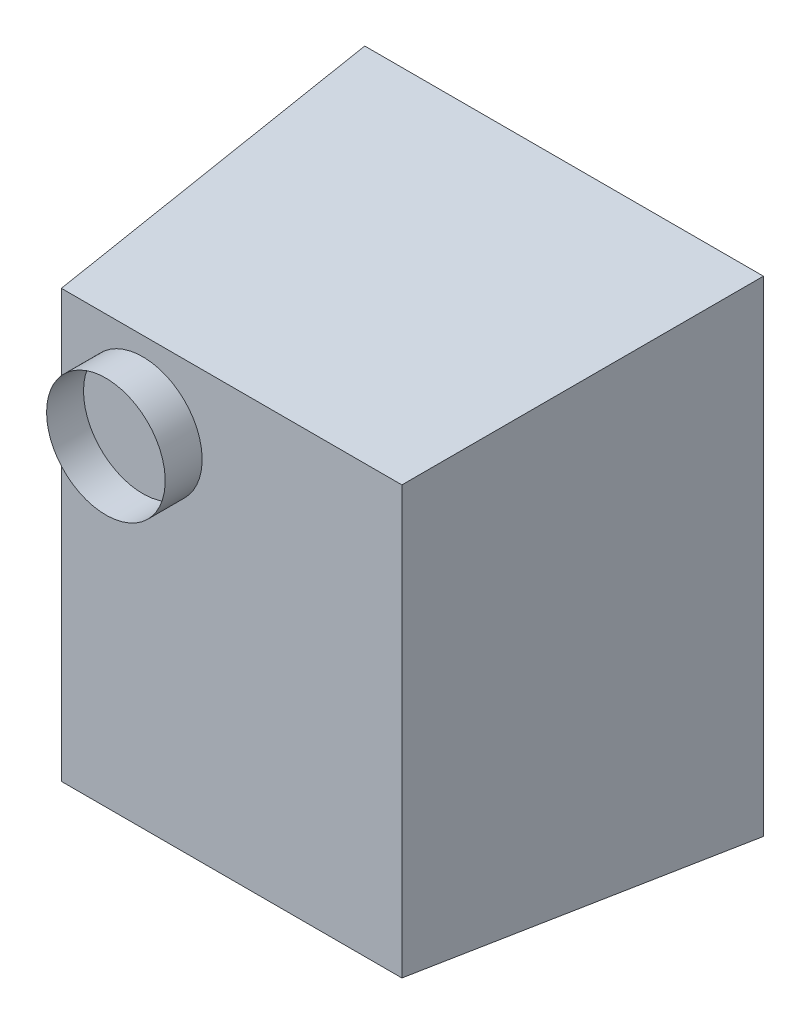
ISO-10303-21;
HEADER;
FILE_DESCRIPTION(('STEP AP214'),'2;1');
FILE_NAME('part.step','',(''),(''),'','','');
FILE_SCHEMA(('AUTOMOTIVE_DESIGN { 1 0 10303 214 1 1 1 1 }'));
ENDSEC;
DATA;
#1=APPLICATION_CONTEXT('core data for automotive mechanical design processes');
#2=APPLICATION_PROTOCOL_DEFINITION('international standard','automotive_design',2000,#1);
#3=PRODUCT_CONTEXT('',#1,'mechanical');
#4=PRODUCT('Part','Part','',(#3));
#5=PRODUCT_RELATED_PRODUCT_CATEGORY('part','',(#4));
#6=PRODUCT_DEFINITION_FORMATION('','',#4);
#7=PRODUCT_DEFINITION_CONTEXT('part definition',#1,'design');
#8=PRODUCT_DEFINITION('design','',#6,#7);
#9=PRODUCT_DEFINITION_SHAPE('','',#8);
#10=(LENGTH_UNIT() NAMED_UNIT(*) SI_UNIT(.MILLI.,.METRE.));
#11=(NAMED_UNIT(*) PLANE_ANGLE_UNIT() SI_UNIT($,.RADIAN.));
#12=(NAMED_UNIT(*) SI_UNIT($,.STERADIAN.) SOLID_ANGLE_UNIT());
#13=UNCERTAINTY_MEASURE_WITH_UNIT(LENGTH_MEASURE(1.E-05),#10,'distance_accuracy_value','');
#14=(GEOMETRIC_REPRESENTATION_CONTEXT(3) GLOBAL_UNCERTAINTY_ASSIGNED_CONTEXT((#13)) GLOBAL_UNIT_ASSIGNED_CONTEXT((#10,
#11,#12)) REPRESENTATION_CONTEXT('',''));
#15=CARTESIAN_POINT('',(0.,0.,0.));
#16=DIRECTION('',(0.,0.,1.));
#17=DIRECTION('',(1.,0.,0.));
#18=AXIS2_PLACEMENT_3D('',#15,#16,#17);
#19=CARTESIAN_POINT('',(-0.046093499,-0.057806686,0.24));
#20=DIRECTION('',(0.,0.,1.));
#21=DIRECTION('',(1.,0.,0.));
#22=AXIS2_PLACEMENT_3D('',#19,#20,#21);
#23=PLANE('',#22);
#24=DIRECTION('',(0.,1.,0.));
#25=VECTOR('',#24,1.);
#26=CARTESIAN_POINT('',(0.046093499,-0.066468834,0.24));
#27=LINE('',#26,#25);
#28=CARTESIAN_POINT('',(0.046093498999738,0.0578066861034849,0.24));
#29=VERTEX_POINT('',#28);
#30=CARTESIAN_POINT('',(0.046093499,-0.057806686034757,0.239999999997005));
#31=VERTEX_POINT('',#30);
#32=EDGE_CURVE('P0_E20',#29,#31,#27,.F.);
#33=ORIENTED_EDGE('',*,*,#32,.F.);
#34=DIRECTION('',(1.,0.,0.));
#35=VECTOR('',#34,1.);
#36=CARTESIAN_POINT('',(-0.054615089,0.0578066859999995,0.24));
#37=LINE('',#36,#35);
#38=CARTESIAN_POINT('',(-0.0460934991892228,0.0578066860689899,0.239999999994537));
#39=VERTEX_POINT('',#38);
#40=EDGE_CURVE('P0_E58',#39,#29,#37,.T.);
#41=ORIENTED_EDGE('',*,*,#40,.F.);
#42=DIRECTION('',(0.,1.,0.));
#43=VECTOR('',#42,1.);
#44=CARTESIAN_POINT('',(-0.0460934990019112,-0.066468834,0.23999999997815));
#45=LINE('',#44,#43);
#46=CARTESIAN_POINT('',(-0.0460934991894848,-0.057806686000262,0.239999999991542));
#47=VERTEX_POINT('',#46);
#48=EDGE_CURVE('P0_E53',#47,#39,#45,.T.);
#49=ORIENTED_EDGE('',*,*,#48,.F.);
#50=DIRECTION('',(1.,0.,0.));
#51=VECTOR('',#50,1.);
#52=CARTESIAN_POINT('',(-0.054615089,-0.0578066860010481,0.23999999998802));
#53=LINE('',#52,#51);
#54=EDGE_CURVE('P0_E68',#31,#47,#53,.F.);
#55=ORIENTED_EDGE('',*,*,#54,.F.);
#56=EDGE_LOOP('',(#33,#41,#49,#55));
#57=FACE_BOUND('',#56,.T.);
#58=ADVANCED_FACE('P0_F17',(#57),#23,.T.);
#59=CARTESIAN_POINT('',(0.046093499,-0.066468834,0.24));
#60=DIRECTION('',(0.996194697820091,0.,0.0871557458526879));
#61=DIRECTION('',(0.0871557458526879,0.,-0.996194697820091));
#62=AXIS2_PLACEMENT_3D('',#59,#60,#61);
#63=PLANE('',#62);
#64=DIRECTION('',(0.,1.,0.));
#65=VECTOR('',#64,1.);
#66=CARTESIAN_POINT('',(0.053967479,-0.065680666,0.15));
#67=LINE('',#66,#65);
#68=CARTESIAN_POINT('',(0.0539674790000237,-0.0656806659938301,0.15));
#69=VERTEX_POINT('',#68);
#70=CARTESIAN_POINT('',(0.0539674790000003,0.0656806659907216,0.150000000000268));
#71=VERTEX_POINT('',#70);
#72=EDGE_CURVE('P0_E74',#69,#71,#67,.T.);
#73=ORIENTED_EDGE('',*,*,#72,.T.);
#74=DIRECTION('',(0.0868265969467221,0.0868265969341361,-0.992432508600705));
#75=VECTOR('',#74,1.);
#76=CARTESIAN_POINT('',(0.0460934990000001,0.0578066860010476,0.23999999998802));
#77=LINE('',#76,#75);
#78=EDGE_CURVE('P0_E63',#29,#71,#77,.T.);
#79=ORIENTED_EDGE('',*,*,#78,.F.);
#80=ORIENTED_EDGE('',*,*,#32,.T.);
#81=DIRECTION('',(-0.0868265969467221,0.0868265969341362,0.992432508600705));
#82=VECTOR('',#81,1.);
#83=CARTESIAN_POINT('',(0.0539674790000001,-0.0656806659999068,0.150000000001071));
#84=LINE('',#83,#82);
#85=EDGE_CURVE('P0_E81',#69,#31,#84,.T.);
#86=ORIENTED_EDGE('',*,*,#85,.F.);
#87=EDGE_LOOP('',(#73,#79,#80,#86));
#88=FACE_BOUND('',#87,.T.);
#89=ADVANCED_FACE('P0_F73',(#88),#63,.T.);
#90=CARTESIAN_POINT('',(-0.054615089,0.065680666,0.15));
#91=DIRECTION('',(0.,0.996194697820091,0.0871557458526879));
#92=DIRECTION('',(0.,-0.0871557458526879,0.996194697820091));
#93=AXIS2_PLACEMENT_3D('',#90,#91,#92);
#94=PLANE('',#93);
#95=DIRECTION('',(1.,0.,0.));
#96=VECTOR('',#95,1.);
#97=CARTESIAN_POINT('',(-0.053967479,0.06568066598766,0.15));
#98=LINE('',#97,#96);
#99=CARTESIAN_POINT('',(-0.0539674790835042,0.0656806659968681,0.149999999998124));
#100=VERTEX_POINT('',#99);
#101=EDGE_CURVE('P0_E84',#71,#100,#98,.F.);
#102=ORIENTED_EDGE('',*,*,#101,.T.);
#103=DIRECTION('',(-0.0868265969341423,0.0868265969459091,-0.992432508600776));
#104=VECTOR('',#103,1.);
#105=CARTESIAN_POINT('',(-0.0460934990019112,0.0578066860000001,0.23999999997815));
#106=LINE('',#105,#104);
#107=EDGE_CURVE('P0_E65',#39,#100,#106,.T.);
#108=ORIENTED_EDGE('',*,*,#107,.F.);
#109=ORIENTED_EDGE('',*,*,#40,.T.);
#110=ORIENTED_EDGE('',*,*,#78,.T.);
#111=EDGE_LOOP('',(#102,#108,#109,#110));
#112=FACE_BOUND('',#111,.T.);
#113=ADVANCED_FACE('P0_F61',(#112),#94,.T.);
#114=CARTESIAN_POINT('',(-0.053967479,-0.066468834,0.15));
#115=DIRECTION('',(-0.996194697820091,0.,0.0871557458526879));
#116=DIRECTION('',(0.0871557458526879,0.,0.996194697820091));
#117=AXIS2_PLACEMENT_3D('',#114,#115,#116);
#118=PLANE('',#117);
#119=DIRECTION('',(0.,1.,0.));
#120=VECTOR('',#119,1.);
#121=CARTESIAN_POINT('',(-0.05396747911112,-0.065680666,0.15));
#122=LINE('',#121,#120);
#123=CARTESIAN_POINT('',(-0.053967479055982,-0.0656806660000001,0.149999999995176));
#124=VERTEX_POINT('',#123);
#125=EDGE_CURVE('P0_E26',#100,#124,#122,.F.);
#126=ORIENTED_EDGE('',*,*,#125,.T.);
#127=DIRECTION('',(-0.0868265953961706,-0.0868265969459143,-0.99243250873533));
#128=VECTOR('',#127,1.);
#129=CARTESIAN_POINT('',(-0.04609349925166,-0.057806686,0.24));
#130=LINE('',#129,#128);
#131=EDGE_CURVE('P0_E34',#47,#124,#130,.T.);
#132=ORIENTED_EDGE('',*,*,#131,.F.);
#133=ORIENTED_EDGE('',*,*,#48,.T.);
#134=ORIENTED_EDGE('',*,*,#107,.T.);
#135=EDGE_LOOP('',(#126,#132,#133,#134));
#136=FACE_BOUND('',#135,.T.);
#137=ADVANCED_FACE('P0_F88',(#136),#118,.T.);
#138=CARTESIAN_POINT('',(-0.054615089,-0.057806686,0.24));
#139=DIRECTION('',(0.,-0.996194697820091,0.0871557458526879));
#140=DIRECTION('',(0.,-0.0871557458526879,-0.996194697820091));
#141=AXIS2_PLACEMENT_3D('',#138,#139,#140);
#142=PLANE('',#141);
#143=DIRECTION('',(1.,0.,0.));
#144=VECTOR('',#143,1.);
#145=CARTESIAN_POINT('',(-0.053967479,-0.065680666,0.15));
#146=LINE('',#145,#144);
#147=EDGE_CURVE('P0_E11',#124,#69,#146,.T.);
#148=ORIENTED_EDGE('',*,*,#147,.T.);
#149=ORIENTED_EDGE('',*,*,#85,.T.);
#150=ORIENTED_EDGE('',*,*,#54,.T.);
#151=ORIENTED_EDGE('',*,*,#131,.T.);
#152=EDGE_LOOP('',(#148,#149,#150,#151));
#153=FACE_BOUND('',#152,.T.);
#154=ADVANCED_FACE('P0_F91',(#153),#142,.T.);
#155=CARTESIAN_POINT('',(-0.053967479,-0.065680666,0.15));
#156=DIRECTION('',(0.,0.,1.));
#157=DIRECTION('',(1.,0.,0.));
#158=AXIS2_PLACEMENT_3D('',#155,#156,#157);
#159=PLANE('',#158);
#160=ORIENTED_EDGE('',*,*,#125,.F.);
#161=ORIENTED_EDGE('',*,*,#101,.F.);
#162=ORIENTED_EDGE('',*,*,#72,.F.);
#163=ORIENTED_EDGE('',*,*,#147,.F.);
#164=EDGE_LOOP('',(#160,#161,#162,#163));
#165=FACE_BOUND('',#164,.T.);
#166=ADVANCED_FACE('P0_F90',(#165),#159,.F.);
#167=CLOSED_SHELL('',(#58,#89,#113,#137,#154,#166));
#168=MANIFOLD_SOLID_BREP('P0_B1',#167);
#169=CARTESIAN_POINT('',(-0.024046523,0.036728116,0.25));
#170=DIRECTION('',(0.,0.,-1.));
#171=DIRECTION('',(-1.,0.,0.));
#172=AXIS2_PLACEMENT_3D('',#169,#170,#171);
#173=CYLINDRICAL_SURFACE('',#172,0.016056825);
#174=CARTESIAN_POINT('',(-0.024046523,0.036728116,0.24));
#175=DIRECTION('',(0.,0.,-1.));
#176=DIRECTION('',(-1.,0.,0.));
#177=AXIS2_PLACEMENT_3D('',#174,#175,#176);
#178=CIRCLE('',#177,0.016056825);
#179=CARTESIAN_POINT('',(-0.040103348,0.036728116,0.24));
#180=VERTEX_POINT('',#179);
#181=EDGE_CURVE('P1_E10',#180,#180,#178,.F.);
#182=ORIENTED_EDGE('',*,*,#181,.T.);
#183=EDGE_LOOP('',(#182));
#184=FACE_BOUND('',#183,.T.);
#185=CARTESIAN_POINT('',(-0.024046523,0.036728116,0.25));
#186=DIRECTION('',(0.,0.,-1.));
#187=DIRECTION('',(-1.,0.,0.));
#188=AXIS2_PLACEMENT_3D('',#185,#186,#187);
#189=CIRCLE('',#188,0.016056825);
#190=CARTESIAN_POINT('',(-0.040103348,0.036728116,0.25));
#191=VERTEX_POINT('',#190);
#192=EDGE_CURVE('P1_E16',#191,#191,#189,.T.);
#193=ORIENTED_EDGE('',*,*,#192,.T.);
#194=EDGE_LOOP('',(#193));
#195=FACE_BOUND('',#194,.T.);
#196=ADVANCED_FACE('P1_F15',(#184,#195),#173,.T.);
#197=OPEN_SHELL('',(#196));
#198=SHELL_BASED_SURFACE_MODEL('P1_B1',(#197));
#199=ADVANCED_BREP_SHAPE_REPRESENTATION('',(#18,#168),#14);
#200=MANIFOLD_SURFACE_SHAPE_REPRESENTATION('',(#18,#198),#14);
#201=SHAPE_REPRESENTATION('',(#18),#14);
#202=SHAPE_DEFINITION_REPRESENTATION(#9,#201);
#203=SHAPE_REPRESENTATION_RELATIONSHIP('','',#201,#199);
#204=SHAPE_REPRESENTATION_RELATIONSHIP('','',#201,#200);
ENDSEC;
END-ISO-10303-21;
